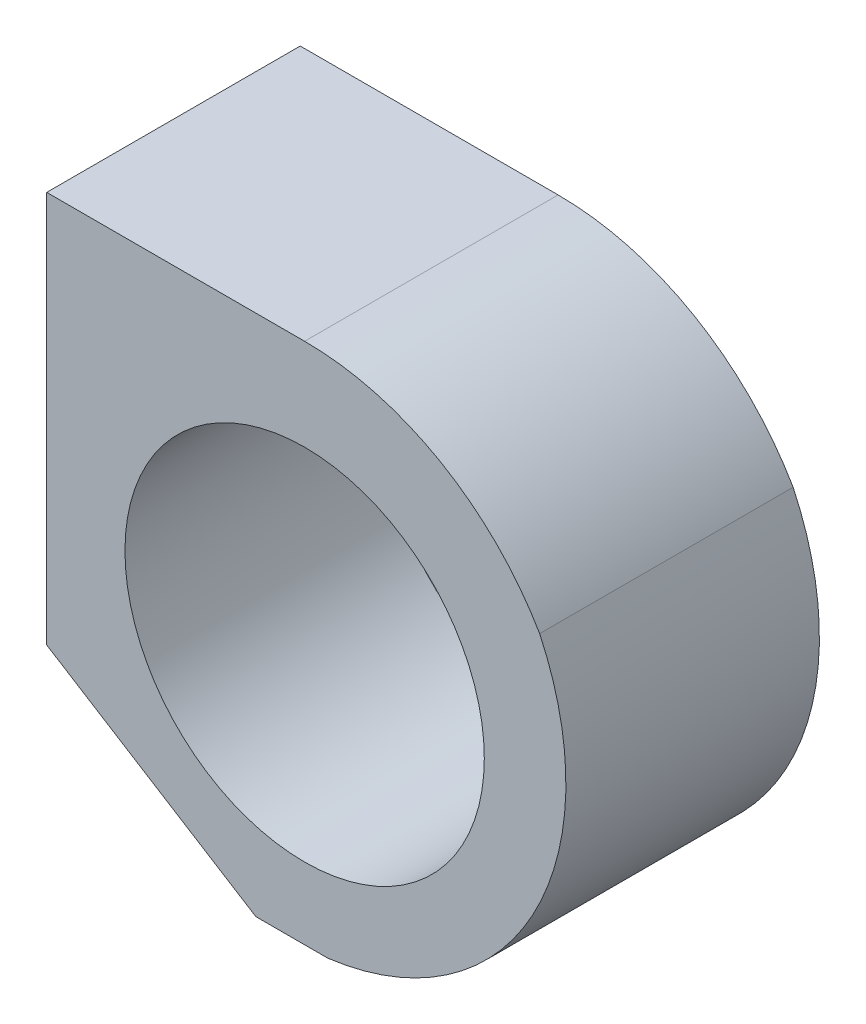
ISO-10303-21;
HEADER;
FILE_DESCRIPTION(('STEP AP214'),'2;1');
FILE_NAME('part.step','',(''),(''),'','','');
FILE_SCHEMA(('AUTOMOTIVE_DESIGN { 1 0 10303 214 1 1 1 1 }'));
ENDSEC;
DATA;
#1=APPLICATION_CONTEXT('core data for automotive mechanical design processes');
#2=APPLICATION_PROTOCOL_DEFINITION('international standard','automotive_design',2000,#1);
#3=PRODUCT_CONTEXT('',#1,'mechanical');
#4=PRODUCT('Part','Part','',(#3));
#5=PRODUCT_RELATED_PRODUCT_CATEGORY('part','',(#4));
#6=PRODUCT_DEFINITION_FORMATION('','',#4);
#7=PRODUCT_DEFINITION_CONTEXT('part definition',#1,'design');
#8=PRODUCT_DEFINITION('design','',#6,#7);
#9=PRODUCT_DEFINITION_SHAPE('','',#8);
#10=(LENGTH_UNIT() NAMED_UNIT(*) SI_UNIT(.MILLI.,.METRE.));
#11=(NAMED_UNIT(*) PLANE_ANGLE_UNIT() SI_UNIT($,.RADIAN.));
#12=(NAMED_UNIT(*) SI_UNIT($,.STERADIAN.) SOLID_ANGLE_UNIT());
#13=UNCERTAINTY_MEASURE_WITH_UNIT(LENGTH_MEASURE(1.E-05),#10,'distance_accuracy_value','');
#14=(GEOMETRIC_REPRESENTATION_CONTEXT(3) GLOBAL_UNCERTAINTY_ASSIGNED_CONTEXT((#13)) GLOBAL_UNIT_ASSIGNED_CONTEXT((#10,
#11,#12)) REPRESENTATION_CONTEXT('',''));
#15=CARTESIAN_POINT('',(0.,0.,0.));
#16=DIRECTION('',(0.,0.,1.));
#17=DIRECTION('',(1.,0.,0.));
#18=AXIS2_PLACEMENT_3D('',#15,#16,#17);
#19=CARTESIAN_POINT('',(0.,0.,19.4));
#20=DIRECTION('',(0.,0.,-0.999999999999999));
#21=DIRECTION('',(-1.,0.,0.));
#22=AXIS2_PLACEMENT_3D('',#19,#20,#21);
#23=PLANE('',#22);
#24=DIRECTION('',(-1.,0.,0.));
#25=VECTOR('',#24,1.);
#26=CARTESIAN_POINT('',(-19.7386345081114,20.767211647944,19.4));
#27=LINE('',#26,#25);
#28=CARTESIAN_POINT('',(0.,20.767211647944,19.4));
#29=VERTEX_POINT('',#28);
#30=CARTESIAN_POINT('',(-19.7386345081114,20.767211647944,19.4));
#31=VERTEX_POINT('',#30);
#32=EDGE_CURVE('E138',#29,#31,#27,.T.);
#33=ORIENTED_EDGE('',*,*,#32,.T.);
#34=DIRECTION('',(0.,-1.,0.));
#35=VECTOR('',#34,1.);
#36=CARTESIAN_POINT('',(-19.7386345081114,20.767211647944,19.4));
#37=LINE('',#36,#35);
#38=CARTESIAN_POINT('',(-19.7386345081114,-9.23278835205598,19.4));
#39=VERTEX_POINT('',#38);
#40=EDGE_CURVE('E96',#31,#39,#37,.T.);
#41=ORIENTED_EDGE('',*,*,#40,.T.);
#42=DIRECTION('',(0.848048096156424,-0.529919264233208,0.));
#43=VECTOR('',#42,1.);
#44=CARTESIAN_POINT('',(-3.73528921770109,-19.232788352056,19.4));
#45=LINE('',#44,#43);
#46=CARTESIAN_POINT('',(-3.73528921770109,-19.232788352056,19.4));
#47=VERTEX_POINT('',#46);
#48=EDGE_CURVE('E109',#39,#47,#45,.T.);
#49=ORIENTED_EDGE('',*,*,#48,.T.);
#50=DIRECTION('',(1.,0.,0.));
#51=VECTOR('',#50,1.);
#52=CARTESIAN_POINT('',(-3.73528921770109,-19.232788352056,19.4));
#53=LINE('',#52,#51);
#54=CARTESIAN_POINT('',(1.77374140690219,-19.232788352056,19.4));
#55=VERTEX_POINT('',#54);
#56=EDGE_CURVE('E103',#47,#55,#53,.T.);
#57=ORIENTED_EDGE('',*,*,#56,.T.);
#58=CARTESIAN_POINT('',(-0.85510317381099,1.45114316178259,19.4));
#59=DIRECTION('',(0.,0.,0.999999999999999));
#60=DIRECTION('',(-1.,0.,0.));
#61=AXIS2_PLACEMENT_3D('',#58,#59,#60);
#62=CIRCLE('',#61,20.8503200622607);
#63=CARTESIAN_POINT('',(17.9849328528877,10.3836058239719,19.4));
#64=VERTEX_POINT('',#63);
#65=EDGE_CURVE('E107',#55,#64,#62,.T.);
#66=ORIENTED_EDGE('',*,*,#65,.T.);
#67=CARTESIAN_POINT('',(0.,0.,19.4));
#68=DIRECTION('',(0.,0.,0.999999999999999));
#69=DIRECTION('',(-1.,0.,0.));
#70=AXIS2_PLACEMENT_3D('',#67,#68,#69);
#71=CIRCLE('',#70,20.767211647944);
#72=EDGE_CURVE('E59',#64,#29,#71,.T.);
#73=ORIENTED_EDGE('',*,*,#72,.T.);
#74=EDGE_LOOP('',(#33,#41,#49,#57,#66,#73));
#75=FACE_BOUND('',#74,.T.);
#76=CARTESIAN_POINT('',(0.,0.,19.4));
#77=DIRECTION('',(0.,0.,0.999999999999999));
#78=DIRECTION('',(1.,0.,0.));
#79=AXIS2_PLACEMENT_3D('',#76,#77,#78);
#80=CIRCLE('',#79,13.75);
#81=CARTESIAN_POINT('',(-13.75,0.,19.4));
#82=VERTEX_POINT('',#81);
#83=EDGE_CURVE('E131',#82,#82,#80,.T.);
#84=ORIENTED_EDGE('',*,*,#83,.F.);
#85=EDGE_LOOP('',(#84));
#86=FACE_BOUND('',#85,.T.);
#87=ADVANCED_FACE('F42',(#75,#86),#23,.F.);
#88=CARTESIAN_POINT('',(0.,0.,0.));
#89=DIRECTION('',(0.,0.,-0.999999999999999));
#90=DIRECTION('',(-1.,0.,0.));
#91=AXIS2_PLACEMENT_3D('',#88,#89,#90);
#92=PLANE('',#91);
#93=DIRECTION('',(-1.,0.,0.));
#94=VECTOR('',#93,1.);
#95=CARTESIAN_POINT('',(-19.7386345081115,20.767211647944,0.));
#96=LINE('',#95,#94);
#97=CARTESIAN_POINT('',(0.,20.767211647944,0.));
#98=VERTEX_POINT('',#97);
#99=CARTESIAN_POINT('',(-19.7386345081115,20.767211647944,0.));
#100=VERTEX_POINT('',#99);
#101=EDGE_CURVE('E127',#98,#100,#96,.T.);
#102=ORIENTED_EDGE('',*,*,#101,.F.);
#103=CARTESIAN_POINT('',(0.,0.,0.));
#104=DIRECTION('',(0.,0.,0.999999999999999));
#105=DIRECTION('',(-1.,0.,0.));
#106=AXIS2_PLACEMENT_3D('',#103,#104,#105);
#107=CIRCLE('',#106,20.767211647944);
#108=CARTESIAN_POINT('',(17.9849328528877,10.3836058239719,0.));
#109=VERTEX_POINT('',#108);
#110=EDGE_CURVE('E88',#109,#98,#107,.T.);
#111=ORIENTED_EDGE('',*,*,#110,.F.);
#112=CARTESIAN_POINT('',(-0.855103173810986,1.45114316178259,0.));
#113=DIRECTION('',(0.,0.,0.999999999999999));
#114=DIRECTION('',(-1.,0.,0.));
#115=AXIS2_PLACEMENT_3D('',#112,#113,#114);
#116=CIRCLE('',#115,20.8503200622607);
#117=CARTESIAN_POINT('',(1.77374140690219,-19.232788352056,0.));
#118=VERTEX_POINT('',#117);
#119=EDGE_CURVE('E82',#118,#109,#116,.T.);
#120=ORIENTED_EDGE('',*,*,#119,.F.);
#121=DIRECTION('',(1.,0.,0.));
#122=VECTOR('',#121,1.);
#123=CARTESIAN_POINT('',(-3.73528921770109,-19.232788352056,0.));
#124=LINE('',#123,#122);
#125=CARTESIAN_POINT('',(-3.73528921770109,-19.232788352056,0.));
#126=VERTEX_POINT('',#125);
#127=EDGE_CURVE('E117',#126,#118,#124,.T.);
#128=ORIENTED_EDGE('',*,*,#127,.F.);
#129=DIRECTION('',(0.848048096156424,-0.529919264233208,0.));
#130=VECTOR('',#129,1.);
#131=CARTESIAN_POINT('',(-3.73528921770109,-19.232788352056,0.));
#132=LINE('',#131,#130);
#133=CARTESIAN_POINT('',(-19.7386345081115,-9.23278835205598,0.));
#134=VERTEX_POINT('',#133);
#135=EDGE_CURVE('E133',#134,#126,#132,.T.);
#136=ORIENTED_EDGE('',*,*,#135,.F.);
#137=DIRECTION('',(0.,-1.,0.));
#138=VECTOR('',#137,1.);
#139=CARTESIAN_POINT('',(-19.7386345081115,20.767211647944,0.));
#140=LINE('',#139,#138);
#141=EDGE_CURVE('E130',#100,#134,#140,.T.);
#142=ORIENTED_EDGE('',*,*,#141,.F.);
#143=EDGE_LOOP('',(#102,#111,#120,#128,#136,#142));
#144=FACE_BOUND('',#143,.T.);
#145=CARTESIAN_POINT('',(0.,0.,0.));
#146=DIRECTION('',(0.,0.,0.999999999999999));
#147=DIRECTION('',(1.,0.,0.));
#148=AXIS2_PLACEMENT_3D('',#145,#146,#147);
#149=CIRCLE('',#148,13.75);
#150=CARTESIAN_POINT('',(-13.75,0.,0.));
#151=VERTEX_POINT('',#150);
#152=EDGE_CURVE('E213',#151,#151,#149,.T.);
#153=ORIENTED_EDGE('',*,*,#152,.T.);
#154=EDGE_LOOP('',(#153));
#155=FACE_BOUND('',#154,.T.);
#156=ADVANCED_FACE('F147',(#144,#155),#92,.T.);
#157=CARTESIAN_POINT('',(-19.7386345081114,20.767211647944,19.4));
#158=DIRECTION('',(0.,-1.,0.));
#159=DIRECTION('',(0.,0.,-0.999999999999999));
#160=AXIS2_PLACEMENT_3D('',#157,#158,#159);
#161=PLANE('',#160);
#162=ORIENTED_EDGE('',*,*,#101,.T.);
#163=DIRECTION('',(0.,0.,-0.999999999999999));
#164=VECTOR('',#163,1.);
#165=CARTESIAN_POINT('',(-19.7386345081114,20.767211647944,19.4));
#166=LINE('',#165,#164);
#167=EDGE_CURVE('E13',#31,#100,#166,.T.);
#168=ORIENTED_EDGE('',*,*,#167,.F.);
#169=ORIENTED_EDGE('',*,*,#32,.F.);
#170=DIRECTION('',(0.,0.,-0.999999999999999));
#171=VECTOR('',#170,1.);
#172=CARTESIAN_POINT('',(0.,20.767211647944,19.4));
#173=LINE('',#172,#171);
#174=EDGE_CURVE('E123',#29,#98,#173,.T.);
#175=ORIENTED_EDGE('',*,*,#174,.T.);
#176=EDGE_LOOP('',(#162,#168,#169,#175));
#177=FACE_BOUND('',#176,.T.);
#178=ADVANCED_FACE('F44',(#177),#161,.F.);
#179=CARTESIAN_POINT('',(-19.7386345081114,20.767211647944,19.4));
#180=DIRECTION('',(1.,0.,0.));
#181=DIRECTION('',(0.,0.,-0.999999999999999));
#182=AXIS2_PLACEMENT_3D('',#179,#180,#181);
#183=PLANE('',#182);
#184=ORIENTED_EDGE('',*,*,#141,.T.);
#185=DIRECTION('',(0.,0.,-0.999999999999999));
#186=VECTOR('',#185,1.);
#187=CARTESIAN_POINT('',(-19.7386345081114,-9.23278835205598,19.4));
#188=LINE('',#187,#186);
#189=EDGE_CURVE('E51',#39,#134,#188,.T.);
#190=ORIENTED_EDGE('',*,*,#189,.F.);
#191=ORIENTED_EDGE('',*,*,#40,.F.);
#192=ORIENTED_EDGE('',*,*,#167,.T.);
#193=EDGE_LOOP('',(#184,#190,#191,#192));
#194=FACE_BOUND('',#193,.T.);
#195=ADVANCED_FACE('F172',(#194),#183,.F.);
#196=CARTESIAN_POINT('',(-3.73528921770109,-19.232788352056,19.4));
#197=DIRECTION('',(0.529919264233209,0.848048096156423,0.));
#198=DIRECTION('',(-0.848048096156424,0.529919264233208,0.));
#199=AXIS2_PLACEMENT_3D('',#196,#197,#198);
#200=PLANE('',#199);
#201=ORIENTED_EDGE('',*,*,#135,.T.);
#202=DIRECTION('',(0.,0.,-0.999999999999999));
#203=VECTOR('',#202,1.);
#204=CARTESIAN_POINT('',(-3.73528921770109,-19.232788352056,19.4));
#205=LINE('',#204,#203);
#206=EDGE_CURVE('E118',#47,#126,#205,.T.);
#207=ORIENTED_EDGE('',*,*,#206,.F.);
#208=ORIENTED_EDGE('',*,*,#48,.F.);
#209=ORIENTED_EDGE('',*,*,#189,.T.);
#210=EDGE_LOOP('',(#201,#207,#208,#209));
#211=FACE_BOUND('',#210,.T.);
#212=ADVANCED_FACE('F144',(#211),#200,.F.);
#213=CARTESIAN_POINT('',(-3.73528921770109,-19.232788352056,19.4));
#214=DIRECTION('',(0.,1.,0.));
#215=DIRECTION('',(-1.,0.,0.));
#216=AXIS2_PLACEMENT_3D('',#213,#214,#215);
#217=PLANE('',#216);
#218=ORIENTED_EDGE('',*,*,#127,.T.);
#219=DIRECTION('',(0.,0.,-0.999999999999999));
#220=VECTOR('',#219,1.);
#221=CARTESIAN_POINT('',(1.77374140690219,-19.232788352056,19.4));
#222=LINE('',#221,#220);
#223=EDGE_CURVE('E114',#55,#118,#222,.T.);
#224=ORIENTED_EDGE('',*,*,#223,.F.);
#225=ORIENTED_EDGE('',*,*,#56,.F.);
#226=ORIENTED_EDGE('',*,*,#206,.T.);
#227=EDGE_LOOP('',(#218,#224,#225,#226));
#228=FACE_BOUND('',#227,.T.);
#229=ADVANCED_FACE('F115',(#228),#217,.F.);
#230=CARTESIAN_POINT('',(-0.85510317381099,1.45114316178259,19.4));
#231=DIRECTION('',(0.,0.,-0.999999999999999));
#232=DIRECTION('',(-1.,0.,0.));
#233=AXIS2_PLACEMENT_3D('',#230,#231,#232);
#234=CYLINDRICAL_SURFACE('',#233,20.8503200622607);
#235=ORIENTED_EDGE('',*,*,#119,.T.);
#236=DIRECTION('',(0.,0.,-0.999999999999999));
#237=VECTOR('',#236,1.);
#238=CARTESIAN_POINT('',(17.9849328528877,10.3836058239719,19.4));
#239=LINE('',#238,#237);
#240=EDGE_CURVE('E119',#64,#109,#239,.T.);
#241=ORIENTED_EDGE('',*,*,#240,.F.);
#242=ORIENTED_EDGE('',*,*,#65,.F.);
#243=ORIENTED_EDGE('',*,*,#223,.T.);
#244=EDGE_LOOP('',(#235,#241,#242,#243));
#245=FACE_BOUND('',#244,.T.);
#246=ADVANCED_FACE('F121',(#245),#234,.T.);
#247=CARTESIAN_POINT('',(0.,0.,19.4));
#248=DIRECTION('',(0.,0.,-0.999999999999999));
#249=DIRECTION('',(-1.,0.,0.));
#250=AXIS2_PLACEMENT_3D('',#247,#248,#249);
#251=CYLINDRICAL_SURFACE('',#250,20.767211647944);
#252=ORIENTED_EDGE('',*,*,#110,.T.);
#253=ORIENTED_EDGE('',*,*,#174,.F.);
#254=ORIENTED_EDGE('',*,*,#72,.F.);
#255=ORIENTED_EDGE('',*,*,#240,.T.);
#256=EDGE_LOOP('',(#252,#253,#254,#255));
#257=FACE_BOUND('',#256,.T.);
#258=ADVANCED_FACE('F152',(#257),#251,.T.);
#259=CARTESIAN_POINT('',(0.,0.,19.4));
#260=DIRECTION('',(0.,0.,-0.999999999999999));
#261=DIRECTION('',(-1.,0.,0.));
#262=AXIS2_PLACEMENT_3D('',#259,#260,#261);
#263=CYLINDRICAL_SURFACE('',#262,13.75);
#264=CARTESIAN_POINT('',(-13.75,0.,19.4));
#265=CARTESIAN_POINT('',(-13.75,0.,19.1979166666666));
#266=CARTESIAN_POINT('',(-13.75,0.,18.9958333333333));
#267=CARTESIAN_POINT('',(-13.75,0.,18.5916666666666));
#268=CARTESIAN_POINT('',(-13.75,0.,18.3895833333333));
#269=CARTESIAN_POINT('',(-13.75,0.,17.9854166666666));
#270=CARTESIAN_POINT('',(-13.75,0.,17.7833333333333));
#271=CARTESIAN_POINT('',(-13.75,0.,17.3791666666666));
#272=CARTESIAN_POINT('',(-13.75,0.,17.1770833333333));
#273=CARTESIAN_POINT('',(-13.75,0.,16.7729166666666));
#274=CARTESIAN_POINT('',(-13.75,0.,16.5708333333333));
#275=CARTESIAN_POINT('',(-13.75,0.,16.1666666666666));
#276=CARTESIAN_POINT('',(-13.75,0.,15.9645833333333));
#277=CARTESIAN_POINT('',(-13.75,0.,15.5604166666666));
#278=CARTESIAN_POINT('',(-13.75,0.,15.3583333333333));
#279=CARTESIAN_POINT('',(-13.75,0.,14.9541666666666));
#280=CARTESIAN_POINT('',(-13.75,0.,14.7520833333333));
#281=CARTESIAN_POINT('',(-13.75,0.,14.3479166666666));
#282=CARTESIAN_POINT('',(-13.75,0.,14.1458333333333));
#283=CARTESIAN_POINT('',(-13.75,0.,13.7416666666666));
#284=CARTESIAN_POINT('',(-13.75,0.,13.5395833333333));
#285=CARTESIAN_POINT('',(-13.75,0.,13.1354166666666));
#286=CARTESIAN_POINT('',(-13.75,0.,12.9333333333333));
#287=CARTESIAN_POINT('',(-13.75,0.,12.5291666666666));
#288=CARTESIAN_POINT('',(-13.75,0.,12.3270833333333));
#289=CARTESIAN_POINT('',(-13.75,0.,11.9229166666666));
#290=CARTESIAN_POINT('',(-13.75,0.,11.7208333333333));
#291=CARTESIAN_POINT('',(-13.75,0.,11.3166666666667));
#292=CARTESIAN_POINT('',(-13.75,0.,11.1145833333333));
#293=CARTESIAN_POINT('',(-13.75,0.,10.7104166666666));
#294=CARTESIAN_POINT('',(-13.75,0.,10.5083333333333));
#295=CARTESIAN_POINT('',(-13.75,0.,10.1041666666667));
#296=CARTESIAN_POINT('',(-13.75,0.,9.90208333333332));
#297=CARTESIAN_POINT('',(-13.75,0.,9.49791666666665));
#298=CARTESIAN_POINT('',(-13.75,0.,9.29583333333332));
#299=CARTESIAN_POINT('',(-13.75,0.,8.89166666666665));
#300=CARTESIAN_POINT('',(-13.75,0.,8.68958333333332));
#301=CARTESIAN_POINT('',(-13.75,0.,8.28541666666665));
#302=CARTESIAN_POINT('',(-13.75,0.,8.08333333333332));
#303=CARTESIAN_POINT('',(-13.75,0.,7.67916666666665));
#304=CARTESIAN_POINT('',(-13.75,0.,7.47708333333332));
#305=CARTESIAN_POINT('',(-13.75,0.,7.07291666666666));
#306=CARTESIAN_POINT('',(-13.75,0.,6.87083333333332));
#307=CARTESIAN_POINT('',(-13.75,0.,6.46666666666666));
#308=CARTESIAN_POINT('',(-13.75,0.,6.26458333333332));
#309=CARTESIAN_POINT('',(-13.75,0.,5.86041666666666));
#310=CARTESIAN_POINT('',(-13.75,0.,5.65833333333332));
#311=CARTESIAN_POINT('',(-13.75,0.,5.25416666666666));
#312=CARTESIAN_POINT('',(-13.75,0.,5.05208333333333));
#313=CARTESIAN_POINT('',(-13.75,0.,4.64791666666666));
#314=CARTESIAN_POINT('',(-13.75,0.,4.44583333333333));
#315=CARTESIAN_POINT('',(-13.75,0.,4.04166666666666));
#316=CARTESIAN_POINT('',(-13.75,0.,3.83958333333333));
#317=CARTESIAN_POINT('',(-13.75,0.,3.43541666666667));
#318=CARTESIAN_POINT('',(-13.75,0.,3.23333333333333));
#319=CARTESIAN_POINT('',(-13.75,0.,2.82916666666667));
#320=CARTESIAN_POINT('',(-13.75,0.,2.62708333333333));
#321=CARTESIAN_POINT('',(-13.75,0.,2.22291666666666));
#322=CARTESIAN_POINT('',(-13.75,0.,2.02083333333333));
#323=CARTESIAN_POINT('',(-13.75,0.,1.61666666666666));
#324=CARTESIAN_POINT('',(-13.75,0.,1.41458333333333));
#325=CARTESIAN_POINT('',(-13.75,0.,1.01041666666667));
#326=CARTESIAN_POINT('',(-13.75,0.,0.808333333333332));
#327=CARTESIAN_POINT('',(-13.75,0.,0.404166666666666));
#328=CARTESIAN_POINT('',(-13.75,0.,0.202083333333333));
#329=CARTESIAN_POINT('',(-13.75,0.,0.));
#330=B_SPLINE_CURVE_WITH_KNOTS('',3,(#264,#265,#266,#267,#268,#269,#270,#271,#272,#273,#274,
#275,#276,#277,#278,#279,#280,#281,#282,#283,#284,#285,#286,#287,#288,#289,#290,#291,#292,#293,
#294,#295,#296,#297,#298,#299,#300,#301,#302,#303,#304,#305,#306,#307,#308,#309,#310,#311,#312,
#313,#314,#315,#316,#317,#318,#319,#320,#321,#322,#323,#324,#325,#326,#327,#328,#329),
.UNSPECIFIED.,.F.,.F.,(4,2,2,2,2,2,2,2,2,2,2,2,2,2,2,2,2,2,2,2,2,2,2,2,2,2,2,2,2,2,2,2,4),(0.,
0.606250000000003,1.2125,1.81875,2.425,3.03125,3.63749999999999,4.24375,4.85,5.45624999999999,
6.06249999999999,6.66874999999999,7.27499999999999,7.88124999999999,8.48749999999999,
9.09374999999999,9.69999999999999,10.30625,10.9125,11.51875,12.125,12.73125,13.3375,13.94375,
14.55,15.15625,15.7625,16.36875,16.975,17.58125,18.1875,18.79375,19.4),.UNSPECIFIED.);
#331=EDGE_CURVE('BSEAM154',#82,#151,#330,.T.);
#332=ORIENTED_EDGE('',*,*,#83,.T.);
#333=ORIENTED_EDGE('',*,*,#152,.F.);
#334=ORIENTED_EDGE('',*,*,#331,.T.);
#335=ORIENTED_EDGE('',*,*,#331,.F.);
#336=EDGE_LOOP('',(#332,#334,#333,#335));
#337=FACE_BOUND('',#336,.T.);
#338=ADVANCED_FACE('F154',(#337),#263,.F.);
#339=CLOSED_SHELL('',(#87,#156,#178,#195,#212,#229,#246,#258,#338));
#340=MANIFOLD_SOLID_BREP('B2',#339);
#341=ADVANCED_BREP_SHAPE_REPRESENTATION('',(#18,#340),#14);
#342=SHAPE_DEFINITION_REPRESENTATION(#9,#341);
ENDSEC;
END-ISO-10303-21;
